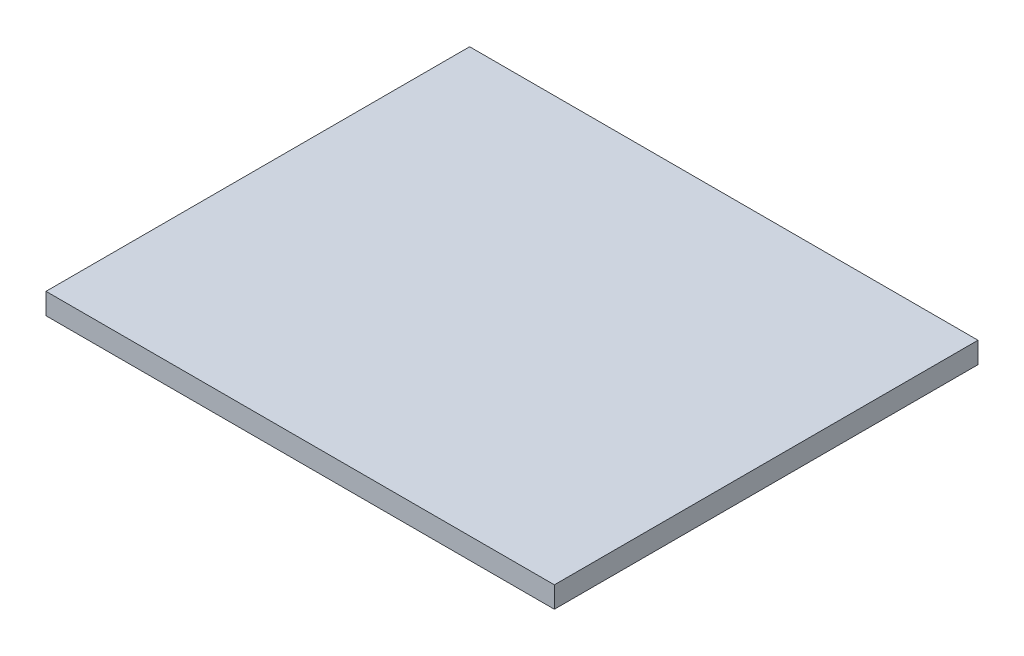
ISO-10303-21;
HEADER;
FILE_DESCRIPTION(('STEP AP214'),'2;1');
FILE_NAME('part.step','',(''),(''),'','','');
FILE_SCHEMA(('AUTOMOTIVE_DESIGN { 1 0 10303 214 1 1 1 1 }'));
ENDSEC;
DATA;
#1=APPLICATION_CONTEXT('core data for automotive mechanical design processes');
#2=APPLICATION_PROTOCOL_DEFINITION('international standard','automotive_design',2000,#1);
#3=PRODUCT_CONTEXT('',#1,'mechanical');
#4=PRODUCT('Part','Part','',(#3));
#5=PRODUCT_RELATED_PRODUCT_CATEGORY('part','',(#4));
#6=PRODUCT_DEFINITION_FORMATION('','',#4);
#7=PRODUCT_DEFINITION_CONTEXT('part definition',#1,'design');
#8=PRODUCT_DEFINITION('design','',#6,#7);
#9=PRODUCT_DEFINITION_SHAPE('','',#8);
#10=(LENGTH_UNIT() NAMED_UNIT(*) SI_UNIT(.MILLI.,.METRE.));
#11=(NAMED_UNIT(*) PLANE_ANGLE_UNIT() SI_UNIT($,.RADIAN.));
#12=(NAMED_UNIT(*) SI_UNIT($,.STERADIAN.) SOLID_ANGLE_UNIT());
#13=UNCERTAINTY_MEASURE_WITH_UNIT(LENGTH_MEASURE(1.E-05),#10,'distance_accuracy_value','');
#14=(GEOMETRIC_REPRESENTATION_CONTEXT(3) GLOBAL_UNCERTAINTY_ASSIGNED_CONTEXT((#13)) GLOBAL_UNIT_ASSIGNED_CONTEXT((#10,
#11,#12)) REPRESENTATION_CONTEXT('',''));
#15=CARTESIAN_POINT('',(0.,0.,0.));
#16=DIRECTION('',(0.,0.,1.));
#17=DIRECTION('',(1.,0.,0.));
#18=AXIS2_PLACEMENT_3D('',#15,#16,#17);
#19=CARTESIAN_POINT('',(-152.4,12.7,-127.));
#20=DIRECTION('',(1.,0.,0.));
#21=DIRECTION('',(0.,0.,-1.));
#22=AXIS2_PLACEMENT_3D('',#19,#20,#21);
#23=PLANE('',#22);
#24=DIRECTION('',(0.,0.,1.));
#25=VECTOR('',#24,1.);
#26=CARTESIAN_POINT('',(-152.4,0.,-127.));
#27=LINE('',#26,#25);
#28=CARTESIAN_POINT('',(-152.4,0.,-127.));
#29=VERTEX_POINT('',#28);
#30=CARTESIAN_POINT('',(-152.4,0.,127.));
#31=VERTEX_POINT('',#30);
#32=EDGE_CURVE('E95',#29,#31,#27,.T.);
#33=ORIENTED_EDGE('',*,*,#32,.T.);
#34=DIRECTION('',(0.,-1.,0.));
#35=VECTOR('',#34,1.);
#36=CARTESIAN_POINT('',(-152.4,12.7,127.));
#37=LINE('',#36,#35);
#38=CARTESIAN_POINT('',(-152.4,12.7,127.));
#39=VERTEX_POINT('',#38);
#40=EDGE_CURVE('E11',#39,#31,#37,.T.);
#41=ORIENTED_EDGE('',*,*,#40,.F.);
#42=DIRECTION('',(0.,0.,1.));
#43=VECTOR('',#42,1.);
#44=CARTESIAN_POINT('',(-152.4,12.7,-127.));
#45=LINE('',#44,#43);
#46=CARTESIAN_POINT('',(-152.4,12.7,-127.));
#47=VERTEX_POINT('',#46);
#48=EDGE_CURVE('E83',#47,#39,#45,.T.);
#49=ORIENTED_EDGE('',*,*,#48,.F.);
#50=DIRECTION('',(0.,-1.,0.));
#51=VECTOR('',#50,1.);
#52=CARTESIAN_POINT('',(-152.4,12.7,-127.));
#53=LINE('',#52,#51);
#54=EDGE_CURVE('E91',#47,#29,#53,.T.);
#55=ORIENTED_EDGE('',*,*,#54,.T.);
#56=EDGE_LOOP('',(#33,#41,#49,#55));
#57=FACE_BOUND('',#56,.T.);
#58=ADVANCED_FACE('F32',(#57),#23,.F.);
#59=CARTESIAN_POINT('',(-152.4,12.7,127.));
#60=DIRECTION('',(0.,0.,-1.));
#61=DIRECTION('',(-1.,0.,0.));
#62=AXIS2_PLACEMENT_3D('',#59,#60,#61);
#63=PLANE('',#62);
#64=DIRECTION('',(1.,0.,0.));
#65=VECTOR('',#64,1.);
#66=CARTESIAN_POINT('',(-152.4,0.,127.));
#67=LINE('',#66,#65);
#68=CARTESIAN_POINT('',(152.4,0.,127.));
#69=VERTEX_POINT('',#68);
#70=EDGE_CURVE('E87',#31,#69,#67,.T.);
#71=ORIENTED_EDGE('',*,*,#70,.T.);
#72=DIRECTION('',(0.,-1.,0.));
#73=VECTOR('',#72,1.);
#74=CARTESIAN_POINT('',(152.4,12.7,127.));
#75=LINE('',#74,#73);
#76=CARTESIAN_POINT('',(152.4,12.7,127.));
#77=VERTEX_POINT('',#76);
#78=EDGE_CURVE('E40',#77,#69,#75,.T.);
#79=ORIENTED_EDGE('',*,*,#78,.F.);
#80=DIRECTION('',(1.,0.,0.));
#81=VECTOR('',#80,1.);
#82=CARTESIAN_POINT('',(-152.4,12.7,127.));
#83=LINE('',#82,#81);
#84=EDGE_CURVE('E78',#39,#77,#83,.T.);
#85=ORIENTED_EDGE('',*,*,#84,.F.);
#86=ORIENTED_EDGE('',*,*,#40,.T.);
#87=EDGE_LOOP('',(#71,#79,#85,#86));
#88=FACE_BOUND('',#87,.T.);
#89=ADVANCED_FACE('F86',(#88),#63,.F.);
#90=CARTESIAN_POINT('',(152.4,12.7,-127.));
#91=DIRECTION('',(-1.,0.,0.));
#92=DIRECTION('',(0.,0.,1.));
#93=AXIS2_PLACEMENT_3D('',#90,#91,#92);
#94=PLANE('',#93);
#95=DIRECTION('',(0.,0.,-1.));
#96=VECTOR('',#95,1.);
#97=CARTESIAN_POINT('',(152.4,0.,-127.));
#98=LINE('',#97,#96);
#99=CARTESIAN_POINT('',(152.4,0.,-127.));
#100=VERTEX_POINT('',#99);
#101=EDGE_CURVE('E65',#69,#100,#98,.T.);
#102=ORIENTED_EDGE('',*,*,#101,.T.);
#103=DIRECTION('',(0.,-1.,0.));
#104=VECTOR('',#103,1.);
#105=CARTESIAN_POINT('',(152.4,12.7,-127.));
#106=LINE('',#105,#104);
#107=CARTESIAN_POINT('',(152.4,12.7,-127.));
#108=VERTEX_POINT('',#107);
#109=EDGE_CURVE('E88',#108,#100,#106,.T.);
#110=ORIENTED_EDGE('',*,*,#109,.F.);
#111=DIRECTION('',(0.,0.,-1.));
#112=VECTOR('',#111,1.);
#113=CARTESIAN_POINT('',(152.4,12.7,-127.));
#114=LINE('',#113,#112);
#115=EDGE_CURVE('E81',#77,#108,#114,.T.);
#116=ORIENTED_EDGE('',*,*,#115,.F.);
#117=ORIENTED_EDGE('',*,*,#78,.T.);
#118=EDGE_LOOP('',(#102,#110,#116,#117));
#119=FACE_BOUND('',#118,.T.);
#120=ADVANCED_FACE('F89',(#119),#94,.F.);
#121=CARTESIAN_POINT('',(-152.4,12.7,-127.));
#122=DIRECTION('',(0.,0.,1.));
#123=DIRECTION('',(1.,0.,0.));
#124=AXIS2_PLACEMENT_3D('',#121,#122,#123);
#125=PLANE('',#124);
#126=DIRECTION('',(-1.,0.,0.));
#127=VECTOR('',#126,1.);
#128=CARTESIAN_POINT('',(-152.4,0.,-127.));
#129=LINE('',#128,#127);
#130=EDGE_CURVE('E71',#100,#29,#129,.T.);
#131=ORIENTED_EDGE('',*,*,#130,.T.);
#132=ORIENTED_EDGE('',*,*,#54,.F.);
#133=DIRECTION('',(-1.,0.,0.));
#134=VECTOR('',#133,1.);
#135=CARTESIAN_POINT('',(-152.4,12.7,-127.));
#136=LINE('',#135,#134);
#137=EDGE_CURVE('E48',#108,#47,#136,.T.);
#138=ORIENTED_EDGE('',*,*,#137,.F.);
#139=ORIENTED_EDGE('',*,*,#109,.T.);
#140=EDGE_LOOP('',(#131,#132,#138,#139));
#141=FACE_BOUND('',#140,.T.);
#142=ADVANCED_FACE('F102',(#141),#125,.F.);
#143=CARTESIAN_POINT('',(0.,12.7,0.));
#144=DIRECTION('',(0.,1.,0.));
#145=DIRECTION('',(0.,0.,1.));
#146=AXIS2_PLACEMENT_3D('',#143,#144,#145);
#147=PLANE('',#146);
#148=ORIENTED_EDGE('',*,*,#48,.T.);
#149=ORIENTED_EDGE('',*,*,#84,.T.);
#150=ORIENTED_EDGE('',*,*,#115,.T.);
#151=ORIENTED_EDGE('',*,*,#137,.T.);
#152=EDGE_LOOP('',(#148,#149,#150,#151));
#153=FACE_BOUND('',#152,.T.);
#154=ADVANCED_FACE('F79',(#153),#147,.T.);
#155=CARTESIAN_POINT('',(0.,0.,0.));
#156=DIRECTION('',(0.,1.,0.));
#157=DIRECTION('',(0.,0.,1.));
#158=AXIS2_PLACEMENT_3D('',#155,#156,#157);
#159=PLANE('',#158);
#160=ORIENTED_EDGE('',*,*,#32,.F.);
#161=ORIENTED_EDGE('',*,*,#130,.F.);
#162=ORIENTED_EDGE('',*,*,#101,.F.);
#163=ORIENTED_EDGE('',*,*,#70,.F.);
#164=EDGE_LOOP('',(#160,#161,#162,#163));
#165=FACE_BOUND('',#164,.T.);
#166=ADVANCED_FACE('F105',(#165),#159,.F.);
#167=CLOSED_SHELL('',(#58,#89,#120,#142,#154,#166));
#168=MANIFOLD_SOLID_BREP('B2',#167);
#169=ADVANCED_BREP_SHAPE_REPRESENTATION('',(#18,#168),#14);
#170=SHAPE_DEFINITION_REPRESENTATION(#9,#169);
ENDSEC;
END-ISO-10303-21;
